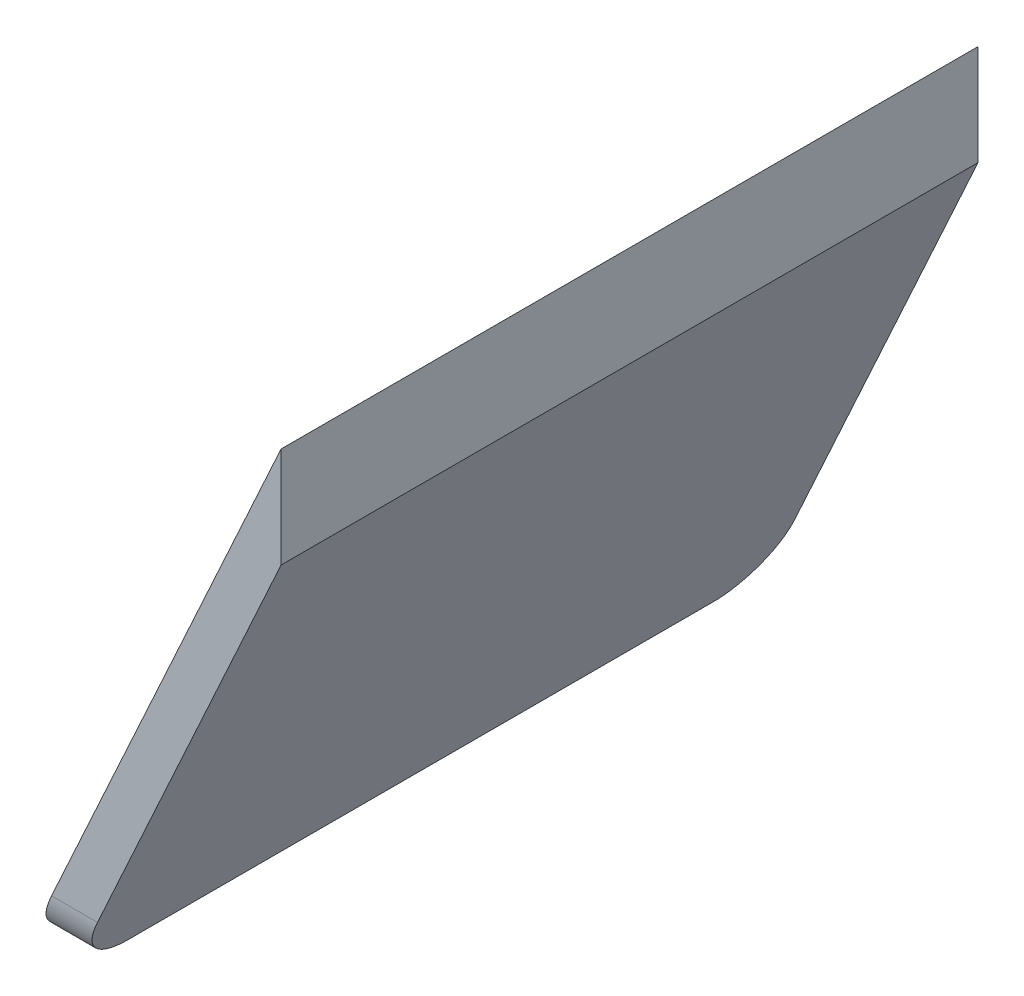
ISO-10303-21;
HEADER;
FILE_DESCRIPTION(('STEP AP214'),'2;1');
FILE_NAME('part.step','',(''),(''),'','','');
FILE_SCHEMA(('AUTOMOTIVE_DESIGN { 1 0 10303 214 1 1 1 1 }'));
ENDSEC;
DATA;
#1=APPLICATION_CONTEXT('core data for automotive mechanical design processes');
#2=APPLICATION_PROTOCOL_DEFINITION('international standard','automotive_design',2000,#1);
#3=PRODUCT_CONTEXT('',#1,'mechanical');
#4=PRODUCT('Part','Part','',(#3));
#5=PRODUCT_RELATED_PRODUCT_CATEGORY('part','',(#4));
#6=PRODUCT_DEFINITION_FORMATION('','',#4);
#7=PRODUCT_DEFINITION_CONTEXT('part definition',#1,'design');
#8=PRODUCT_DEFINITION('design','',#6,#7);
#9=PRODUCT_DEFINITION_SHAPE('','',#8);
#10=(LENGTH_UNIT() NAMED_UNIT(*) SI_UNIT(.MILLI.,.METRE.));
#11=(NAMED_UNIT(*) PLANE_ANGLE_UNIT() SI_UNIT($,.RADIAN.));
#12=(NAMED_UNIT(*) SI_UNIT($,.STERADIAN.) SOLID_ANGLE_UNIT());
#13=UNCERTAINTY_MEASURE_WITH_UNIT(LENGTH_MEASURE(1.E-05),#10,'distance_accuracy_value','');
#14=(GEOMETRIC_REPRESENTATION_CONTEXT(3) GLOBAL_UNCERTAINTY_ASSIGNED_CONTEXT((#13)) GLOBAL_UNIT_ASSIGNED_CONTEXT((#10,
#11,#12)) REPRESENTATION_CONTEXT('',''));
#15=CARTESIAN_POINT('',(0.,0.,0.));
#16=DIRECTION('',(0.,0.,1.));
#17=DIRECTION('',(1.,0.,0.));
#18=AXIS2_PLACEMENT_3D('',#15,#16,#17);
#19=CARTESIAN_POINT('',(-3.29902336935198,0.,50.));
#20=DIRECTION('',(0.,1.,0.));
#21=DIRECTION('',(-1.,0.,0.));
#22=AXIS2_PLACEMENT_3D('',#19,#20,#21);
#23=PLANE('',#22);
#24=DIRECTION('',(0.,0.,-1.));
#25=VECTOR('',#24,1.);
#26=CARTESIAN_POINT('',(-3.29902336935198,0.,50.));
#27=LINE('',#26,#25);
#28=CARTESIAN_POINT('',(-3.29902336935198,0.,46.));
#29=VERTEX_POINT('',#28);
#30=CARTESIAN_POINT('',(-3.29902336935198,0.,4.));
#31=VERTEX_POINT('',#30);
#32=EDGE_CURVE('E346',#29,#31,#27,.T.);
#33=ORIENTED_EDGE('',*,*,#32,.T.);
#34=DIRECTION('',(1.,0.,0.));
#35=VECTOR('',#34,1.);
#36=CARTESIAN_POINT('',(-3.29902336935198,0.,4.));
#37=LINE('',#36,#35);
#38=CARTESIAN_POINT('',(0.,0.,4.));
#39=VERTEX_POINT('',#38);
#40=EDGE_CURVE('E365',#31,#39,#37,.T.);
#41=ORIENTED_EDGE('',*,*,#40,.T.);
#42=DIRECTION('',(0.,0.,-1.));
#43=VECTOR('',#42,1.);
#44=CARTESIAN_POINT('',(0.,0.,50.));
#45=LINE('',#44,#43);
#46=CARTESIAN_POINT('',(0.,0.,46.));
#47=VERTEX_POINT('',#46);
#48=EDGE_CURVE('E360',#47,#39,#45,.T.);
#49=ORIENTED_EDGE('',*,*,#48,.F.);
#50=DIRECTION('',(1.,0.,0.));
#51=VECTOR('',#50,1.);
#52=CARTESIAN_POINT('',(-3.29902336935198,0.,46.));
#53=LINE('',#52,#51);
#54=EDGE_CURVE('E363',#47,#29,#53,.F.);
#55=ORIENTED_EDGE('',*,*,#54,.T.);
#56=EDGE_LOOP('',(#33,#41,#49,#55));
#57=FACE_BOUND('',#56,.T.);
#58=ADVANCED_FACE('F33',(#57),#23,.F.);
#59=CARTESIAN_POINT('',(0.,0.,50.));
#60=DIRECTION('',(-0.909360032993425,0.416010012372535,0.));
#61=DIRECTION('',(-0.416010012372535,-0.909360032993425,0.));
#62=AXIS2_PLACEMENT_3D('',#59,#60,#61);
#63=PLANE('',#62);
#64=ORIENTED_EDGE('',*,*,#48,.T.);
#65=CARTESIAN_POINT('',(1.8299023369352,4.,4.));
#66=DIRECTION('',(-0.909360032993425,0.416010012372535,0.));
#67=DIRECTION('',(0.416010012372535,0.909360032993425,0.));
#68=AXIS2_PLACEMENT_3D('',#65,#66,#67);
#69=ELLIPSE('',#68,4.39869782580264,4.);
#70=CARTESIAN_POINT('',(1.8299023369352,4.,0.));
#71=VERTEX_POINT('',#70);
#72=EDGE_CURVE('E370',#39,#71,#69,.F.);
#73=ORIENTED_EDGE('',*,*,#72,.T.);
#74=DIRECTION('',(0.416010012372534,0.909360032993425,0.));
#75=VECTOR('',#74,1.);
#76=CARTESIAN_POINT('',(0.,0.,0.));
#77=LINE('',#76,#75);
#78=CARTESIAN_POINT('',(15.,32.7886351030573,0.));
#79=VERTEX_POINT('',#78);
#80=EDGE_CURVE('E307',#71,#79,#77,.T.);
#81=ORIENTED_EDGE('',*,*,#80,.T.);
#82=DIRECTION('',(0.,0.,-1.));
#83=VECTOR('',#82,1.);
#84=CARTESIAN_POINT('',(15.,32.7886351030573,50.));
#85=LINE('',#84,#83);
#86=CARTESIAN_POINT('',(15.,32.7886351030573,50.));
#87=VERTEX_POINT('',#86);
#88=EDGE_CURVE('E357',#87,#79,#85,.T.);
#89=ORIENTED_EDGE('',*,*,#88,.F.);
#90=DIRECTION('',(0.416010012372534,0.909360032993425,0.));
#91=VECTOR('',#90,1.);
#92=CARTESIAN_POINT('',(0.,0.,50.));
#93=LINE('',#92,#91);
#94=CARTESIAN_POINT('',(1.8299023369352,4.,50.));
#95=VERTEX_POINT('',#94);
#96=EDGE_CURVE('E339',#95,#87,#93,.T.);
#97=ORIENTED_EDGE('',*,*,#96,.F.);
#98=CARTESIAN_POINT('',(1.8299023369352,4.,46.));
#99=DIRECTION('',(-0.909360032993425,0.416010012372535,0.));
#100=DIRECTION('',(-0.416010012372535,-0.909360032993425,0.));
#101=AXIS2_PLACEMENT_3D('',#98,#99,#100);
#102=ELLIPSE('',#101,4.39869782580264,4.);
#103=EDGE_CURVE('E368',#95,#47,#102,.F.);
#104=ORIENTED_EDGE('',*,*,#103,.T.);
#105=EDGE_LOOP('',(#64,#73,#81,#89,#97,#104));
#106=FACE_BOUND('',#105,.T.);
#107=ADVANCED_FACE('F386',(#106),#63,.F.);
#108=CARTESIAN_POINT('',(15.,32.7886351030573,50.));
#109=DIRECTION('',(-1.,0.,0.));
#110=DIRECTION('',(0.,0.,1.));
#111=AXIS2_PLACEMENT_3D('',#108,#109,#110);
#112=PLANE('',#111);
#113=DIRECTION('',(0.,1.,0.));
#114=VECTOR('',#113,1.);
#115=CARTESIAN_POINT('',(15.,32.7886351030573,0.));
#116=LINE('',#115,#114);
#117=CARTESIAN_POINT('',(15.,40.,0.));
#118=VERTEX_POINT('',#117);
#119=EDGE_CURVE('E348',#79,#118,#116,.T.);
#120=ORIENTED_EDGE('',*,*,#119,.T.);
#121=DIRECTION('',(0.,0.,-1.));
#122=VECTOR('',#121,1.);
#123=CARTESIAN_POINT('',(15.,40.,50.));
#124=LINE('',#123,#122);
#125=CARTESIAN_POINT('',(15.,40.,50.));
#126=VERTEX_POINT('',#125);
#127=EDGE_CURVE('E354',#126,#118,#124,.T.);
#128=ORIENTED_EDGE('',*,*,#127,.F.);
#129=DIRECTION('',(0.,1.,0.));
#130=VECTOR('',#129,1.);
#131=CARTESIAN_POINT('',(15.,32.7886351030573,50.));
#132=LINE('',#131,#130);
#133=EDGE_CURVE('E341',#87,#126,#132,.T.);
#134=ORIENTED_EDGE('',*,*,#133,.F.);
#135=ORIENTED_EDGE('',*,*,#88,.T.);
#136=EDGE_LOOP('',(#120,#128,#134,#135));
#137=FACE_BOUND('',#136,.T.);
#138=ADVANCED_FACE('F393',(#137),#112,.F.);
#139=CARTESIAN_POINT('',(15.,40.,50.));
#140=DIRECTION('',(0.909360032993425,-0.416010012372534,0.));
#141=DIRECTION('',(0.416010012372534,0.909360032993425,0.));
#142=AXIS2_PLACEMENT_3D('',#139,#140,#141);
#143=PLANE('',#142);
#144=DIRECTION('',(0.,0.,-1.));
#145=VECTOR('',#144,1.);
#146=CARTESIAN_POINT('',(10.925539607517,31.0936003299342,24.));
#147=LINE('',#146,#145);
#148=CARTESIAN_POINT('',(10.925539607517,31.0936003299342,24.));
#149=VERTEX_POINT('',#148);
#150=CARTESIAN_POINT('',(10.925539607517,31.0936003299342,13.5));
#151=VERTEX_POINT('',#150);
#152=EDGE_CURVE('E259',#149,#151,#147,.T.);
#153=ORIENTED_EDGE('',*,*,#152,.F.);
#154=DIRECTION('',(0.416010012372534,0.909360032993425,0.));
#155=VECTOR('',#154,1.);
#156=CARTESIAN_POINT('',(8.42947953328174,25.6374401319737,24.));
#157=LINE('',#156,#155);
#158=CARTESIAN_POINT('',(8.42947953328174,25.6374401319737,24.));
#159=VERTEX_POINT('',#158);
#160=EDGE_CURVE('E48',#159,#149,#157,.T.);
#161=ORIENTED_EDGE('',*,*,#160,.F.);
#162=DIRECTION('',(0.,0.,1.));
#163=VECTOR('',#162,1.);
#164=CARTESIAN_POINT('',(8.42947953328174,25.6374401319737,22.));
#165=LINE('',#164,#163);
#166=CARTESIAN_POINT('',(8.42947953328174,25.6374401319737,22.));
#167=VERTEX_POINT('',#166);
#168=EDGE_CURVE('E217',#167,#159,#165,.T.);
#169=ORIENTED_EDGE('',*,*,#168,.F.);
#170=DIRECTION('',(0.416010012372534,0.909360032993425,0.));
#171=VECTOR('',#170,1.);
#172=CARTESIAN_POINT('',(5.10139943430147,18.3625598680263,22.));
#173=LINE('',#172,#171);
#174=CARTESIAN_POINT('',(5.10139943430147,18.3625598680263,22.));
#175=VERTEX_POINT('',#174);
#176=EDGE_CURVE('E220',#175,#167,#173,.T.);
#177=ORIENTED_EDGE('',*,*,#176,.F.);
#178=DIRECTION('',(0.,0.,1.));
#179=VECTOR('',#178,1.);
#180=CARTESIAN_POINT('',(5.10139943430147,18.3625598680263,22.));
#181=LINE('',#180,#179);
#182=CARTESIAN_POINT('',(5.10139943430147,18.3625598680263,28.));
#183=VERTEX_POINT('',#182);
#184=EDGE_CURVE('E300',#175,#183,#181,.T.);
#185=ORIENTED_EDGE('',*,*,#184,.T.);
#186=DIRECTION('',(0.416010012372534,0.909360032993425,0.));
#187=VECTOR('',#186,1.);
#188=CARTESIAN_POINT('',(5.10139943430147,18.3625598680263,28.));
#189=LINE('',#188,#187);
#190=CARTESIAN_POINT('',(8.42947953328174,25.6374401319737,28.));
#191=VERTEX_POINT('',#190);
#192=EDGE_CURVE('E297',#183,#191,#189,.T.);
#193=ORIENTED_EDGE('',*,*,#192,.T.);
#194=DIRECTION('',(0.,0.,-1.));
#195=VECTOR('',#194,1.);
#196=CARTESIAN_POINT('',(8.42947953328174,25.6374401319737,28.));
#197=LINE('',#196,#195);
#198=CARTESIAN_POINT('',(8.42947953328174,25.6374401319737,26.));
#199=VERTEX_POINT('',#198);
#200=EDGE_CURVE('E294',#191,#199,#197,.T.);
#201=ORIENTED_EDGE('',*,*,#200,.T.);
#202=DIRECTION('',(0.416010012372535,0.909360032993425,0.));
#203=VECTOR('',#202,1.);
#204=CARTESIAN_POINT('',(8.42947953328174,25.6374401319737,26.));
#205=LINE('',#204,#203);
#206=CARTESIAN_POINT('',(10.925539607517,31.0936003299342,26.));
#207=VERTEX_POINT('',#206);
#208=EDGE_CURVE('E291',#199,#207,#205,.T.);
#209=ORIENTED_EDGE('',*,*,#208,.T.);
#210=DIRECTION('',(0.,0.,1.));
#211=VECTOR('',#210,1.);
#212=CARTESIAN_POINT('',(10.925539607517,31.0936003299342,26.));
#213=LINE('',#212,#211);
#214=CARTESIAN_POINT('',(10.925539607517,31.0936003299342,36.5));
#215=VERTEX_POINT('',#214);
#216=EDGE_CURVE('E288',#207,#215,#213,.T.);
#217=ORIENTED_EDGE('',*,*,#216,.T.);
#218=DIRECTION('',(-0.416010012372535,-0.909360032993425,0.));
#219=VECTOR('',#218,1.);
#220=CARTESIAN_POINT('',(10.925539607517,31.0936003299342,36.5));
#221=LINE('',#220,#219);
#222=CARTESIAN_POINT('',(8.42947953328175,25.6374401319737,36.5));
#223=VERTEX_POINT('',#222);
#224=EDGE_CURVE('E285',#215,#223,#221,.T.);
#225=ORIENTED_EDGE('',*,*,#224,.T.);
#226=DIRECTION('',(0.,0.,-1.));
#227=VECTOR('',#226,1.);
#228=CARTESIAN_POINT('',(8.42947953328175,25.6374401319737,36.5));
#229=LINE('',#228,#227);
#230=CARTESIAN_POINT('',(8.42947953328174,25.6374401319737,34.5));
#231=VERTEX_POINT('',#230);
#232=EDGE_CURVE('E282',#223,#231,#229,.T.);
#233=ORIENTED_EDGE('',*,*,#232,.T.);
#234=DIRECTION('',(-0.416010012372534,-0.909360032993425,0.));
#235=VECTOR('',#234,1.);
#236=CARTESIAN_POINT('',(8.42947953328174,25.6374401319737,34.5));
#237=LINE('',#236,#235);
#238=CARTESIAN_POINT('',(4.2693794095564,16.5438398020394,34.5));
#239=VERTEX_POINT('',#238);
#240=EDGE_CURVE('E279',#231,#239,#237,.T.);
#241=ORIENTED_EDGE('',*,*,#240,.T.);
#242=DIRECTION('',(0.2763820088115,0.604145922398015,0.747409318683659));
#243=VECTOR('',#242,1.);
#244=CARTESIAN_POINT('',(2.60533936006626,12.9063996700657,30.));
#245=LINE('',#244,#243);
#246=CARTESIAN_POINT('',(2.60533936006626,12.9063996700657,30.));
#247=VERTEX_POINT('',#246);
#248=EDGE_CURVE('E276',#247,#239,#245,.T.);
#249=ORIENTED_EDGE('',*,*,#248,.F.);
#250=DIRECTION('',(0.,0.,1.));
#251=VECTOR('',#250,1.);
#252=CARTESIAN_POINT('',(2.60533936006626,12.9063996700657,20.));
#253=LINE('',#252,#251);
#254=CARTESIAN_POINT('',(2.60533936006626,12.9063996700657,20.));
#255=VERTEX_POINT('',#254);
#256=EDGE_CURVE('E273',#255,#247,#253,.T.);
#257=ORIENTED_EDGE('',*,*,#256,.F.);
#258=DIRECTION('',(-0.276382008811499,-0.604145922398015,0.74740931868366));
#259=VECTOR('',#258,1.);
#260=CARTESIAN_POINT('',(4.2693794095564,16.5438398020394,15.5));
#261=LINE('',#260,#259);
#262=CARTESIAN_POINT('',(4.2693794095564,16.5438398020394,15.5));
#263=VERTEX_POINT('',#262);
#264=EDGE_CURVE('E270',#263,#255,#261,.T.);
#265=ORIENTED_EDGE('',*,*,#264,.F.);
#266=DIRECTION('',(-0.416010012372534,-0.909360032993426,0.));
#267=VECTOR('',#266,1.);
#268=CARTESIAN_POINT('',(8.42947953328175,25.6374401319737,15.5));
#269=LINE('',#268,#267);
#270=CARTESIAN_POINT('',(8.42947953328175,25.6374401319737,15.5));
#271=VERTEX_POINT('',#270);
#272=EDGE_CURVE('E267',#271,#263,#269,.T.);
#273=ORIENTED_EDGE('',*,*,#272,.F.);
#274=DIRECTION('',(0.,0.,1.));
#275=VECTOR('',#274,1.);
#276=CARTESIAN_POINT('',(8.42947953328175,25.6374401319737,13.5));
#277=LINE('',#276,#275);
#278=CARTESIAN_POINT('',(8.42947953328175,25.6374401319737,13.5));
#279=VERTEX_POINT('',#278);
#280=EDGE_CURVE('E264',#279,#271,#277,.T.);
#281=ORIENTED_EDGE('',*,*,#280,.F.);
#282=DIRECTION('',(-0.416010012372535,-0.909360032993425,0.));
#283=VECTOR('',#282,1.);
#284=CARTESIAN_POINT('',(10.925539607517,31.0936003299342,13.5));
#285=LINE('',#284,#283);
#286=EDGE_CURVE('E261',#151,#279,#285,.T.);
#287=ORIENTED_EDGE('',*,*,#286,.F.);
#288=EDGE_LOOP('',(#153,#161,#169,#177,#185,#193,#201,#209,#217,#225,#233,#241,#249,#257,#265,
#273,#281,#287));
#289=FACE_BOUND('',#288,.T.);
#290=DIRECTION('',(-0.416010012372534,-0.909360032993425,0.));
#291=VECTOR('',#290,1.);
#292=CARTESIAN_POINT('',(15.,40.,0.));
#293=LINE('',#292,#291);
#294=CARTESIAN_POINT('',(-1.46912103241678,3.99999999999999,0.));
#295=VERTEX_POINT('',#294);
#296=EDGE_CURVE('E342',#118,#295,#293,.T.);
#297=ORIENTED_EDGE('',*,*,#296,.T.);
#298=CARTESIAN_POINT('',(-1.46912103241678,4.,4.));
#299=DIRECTION('',(0.909360032993425,-0.416010012372534,0.));
#300=DIRECTION('',(0.416010012372534,0.909360032993425,0.));
#301=AXIS2_PLACEMENT_3D('',#298,#299,#300);
#302=ELLIPSE('',#301,4.39869782580264,4.);
#303=EDGE_CURVE('E41',#295,#31,#302,.F.);
#304=ORIENTED_EDGE('',*,*,#303,.T.);
#305=ORIENTED_EDGE('',*,*,#32,.F.);
#306=CARTESIAN_POINT('',(-1.46912103241678,4.,46.));
#307=DIRECTION('',(0.909360032993425,-0.416010012372534,0.));
#308=DIRECTION('',(-0.416010012372534,-0.909360032993425,0.));
#309=AXIS2_PLACEMENT_3D('',#306,#307,#308);
#310=ELLIPSE('',#309,4.39869782580264,4.);
#311=CARTESIAN_POINT('',(-1.46912103241678,3.99999999999999,50.));
#312=VERTEX_POINT('',#311);
#313=EDGE_CURVE('E56',#29,#312,#310,.F.);
#314=ORIENTED_EDGE('',*,*,#313,.T.);
#315=DIRECTION('',(-0.416010012372534,-0.909360032993425,0.));
#316=VECTOR('',#315,1.);
#317=CARTESIAN_POINT('',(15.,40.,50.));
#318=LINE('',#317,#316);
#319=EDGE_CURVE('E344',#126,#312,#318,.T.);
#320=ORIENTED_EDGE('',*,*,#319,.F.);
#321=ORIENTED_EDGE('',*,*,#127,.T.);
#322=EDGE_LOOP('',(#297,#304,#305,#314,#320,#321));
#323=FACE_BOUND('',#322,.T.);
#324=ADVANCED_FACE('F375',(#289,#323),#143,.F.);
#325=CARTESIAN_POINT('',(0.,0.,50.));
#326=DIRECTION('',(0.,0.,1.));
#327=DIRECTION('',(1.,0.,0.));
#328=AXIS2_PLACEMENT_3D('',#325,#326,#327);
#329=PLANE('',#328);
#330=ORIENTED_EDGE('',*,*,#319,.T.);
#331=DIRECTION('',(1.,0.,0.));
#332=VECTOR('',#331,1.);
#333=CARTESIAN_POINT('',(0.,4.,50.));
#334=LINE('',#333,#332);
#335=EDGE_CURVE('E11',#312,#95,#334,.T.);
#336=ORIENTED_EDGE('',*,*,#335,.T.);
#337=ORIENTED_EDGE('',*,*,#96,.T.);
#338=ORIENTED_EDGE('',*,*,#133,.T.);
#339=EDGE_LOOP('',(#330,#336,#337,#338));
#340=FACE_BOUND('',#339,.T.);
#341=ADVANCED_FACE('F397',(#340),#329,.T.);
#342=CARTESIAN_POINT('',(0.,0.,0.));
#343=DIRECTION('',(0.,0.,1.));
#344=DIRECTION('',(1.,0.,0.));
#345=AXIS2_PLACEMENT_3D('',#342,#343,#344);
#346=PLANE('',#345);
#347=ORIENTED_EDGE('',*,*,#80,.F.);
#348=DIRECTION('',(1.,0.,0.));
#349=VECTOR('',#348,1.);
#350=CARTESIAN_POINT('',(0.,4.,0.));
#351=LINE('',#350,#349);
#352=EDGE_CURVE('E372',#71,#295,#351,.F.);
#353=ORIENTED_EDGE('',*,*,#352,.T.);
#354=ORIENTED_EDGE('',*,*,#296,.F.);
#355=ORIENTED_EDGE('',*,*,#119,.F.);
#356=EDGE_LOOP('',(#347,#353,#354,#355));
#357=FACE_BOUND('',#356,.T.);
#358=ADVANCED_FACE('F390',(#357),#346,.F.);
#359=CARTESIAN_POINT('',(-3.29902336935198,4.,4.));
#360=DIRECTION('',(1.,0.,0.));
#361=DIRECTION('',(0.,1.,0.));
#362=AXIS2_PLACEMENT_3D('',#359,#360,#361);
#363=CYLINDRICAL_SURFACE('',#362,4.);
#364=ORIENTED_EDGE('',*,*,#303,.F.);
#365=ORIENTED_EDGE('',*,*,#352,.F.);
#366=ORIENTED_EDGE('',*,*,#72,.F.);
#367=ORIENTED_EDGE('',*,*,#40,.F.);
#368=EDGE_LOOP('',(#364,#365,#366,#367));
#369=FACE_BOUND('',#368,.T.);
#370=ADVANCED_FACE('F383',(#369),#363,.T.);
#371=CARTESIAN_POINT('',(0.,4.,46.));
#372=DIRECTION('',(-1.,0.,0.));
#373=DIRECTION('',(0.,-1.,0.));
#374=AXIS2_PLACEMENT_3D('',#371,#372,#373);
#375=CYLINDRICAL_SURFACE('',#374,4.);
#376=ORIENTED_EDGE('',*,*,#313,.F.);
#377=ORIENTED_EDGE('',*,*,#54,.F.);
#378=ORIENTED_EDGE('',*,*,#103,.F.);
#379=ORIENTED_EDGE('',*,*,#335,.F.);
#380=EDGE_LOOP('',(#376,#377,#378,#379));
#381=FACE_BOUND('',#380,.T.);
#382=ADVANCED_FACE('F35',(#381),#375,.T.);
#383=CARTESIAN_POINT('',(9.79351958277188,25.0134251134149,24.));
#384=DIRECTION('',(0.,0.,1.));
#385=DIRECTION('',(1.,0.,0.));
#386=AXIS2_PLACEMENT_3D('',#383,#384,#385);
#387=PLANE('',#386);
#388=ORIENTED_EDGE('',*,*,#160,.T.);
#389=DIRECTION('',(-0.909360032993425,0.416010012372534,0.));
#390=VECTOR('',#389,1.);
#391=CARTESIAN_POINT('',(12.2895796570071,30.4695853113754,24.));
#392=LINE('',#391,#390);
#393=CARTESIAN_POINT('',(12.2895796570071,30.4695853113754,24.));
#394=VERTEX_POINT('',#393);
#395=EDGE_CURVE('E194',#394,#149,#392,.T.);
#396=ORIENTED_EDGE('',*,*,#395,.F.);
#397=DIRECTION('',(0.416010012372534,0.909360032993425,0.));
#398=VECTOR('',#397,1.);
#399=CARTESIAN_POINT('',(9.79351958277188,25.0134251134149,24.));
#400=LINE('',#399,#398);
#401=CARTESIAN_POINT('',(9.79351958277188,25.0134251134149,24.));
#402=VERTEX_POINT('',#401);
#403=EDGE_CURVE('E198',#402,#394,#400,.T.);
#404=ORIENTED_EDGE('',*,*,#403,.F.);
#405=DIRECTION('',(-0.909360032993425,0.416010012372534,0.));
#406=VECTOR('',#405,1.);
#407=CARTESIAN_POINT('',(9.79351958277188,25.0134251134149,24.));
#408=LINE('',#407,#406);
#409=EDGE_CURVE('E305',#402,#159,#408,.T.);
#410=ORIENTED_EDGE('',*,*,#409,.T.);
#411=EDGE_LOOP('',(#388,#396,#404,#410));
#412=FACE_BOUND('',#411,.T.);
#413=ADVANCED_FACE('F196',(#412),#387,.F.);
#414=CARTESIAN_POINT('',(9.79351958277188,25.0134251134149,22.));
#415=DIRECTION('',(-0.416010012372534,-0.909360032993425,0.));
#416=DIRECTION('',(0.909360032993425,-0.416010012372534,0.));
#417=AXIS2_PLACEMENT_3D('',#414,#415,#416);
#418=PLANE('',#417);
#419=ORIENTED_EDGE('',*,*,#168,.T.);
#420=ORIENTED_EDGE('',*,*,#409,.F.);
#421=DIRECTION('',(0.,0.,1.));
#422=VECTOR('',#421,1.);
#423=CARTESIAN_POINT('',(9.79351958277188,25.0134251134149,22.));
#424=LINE('',#423,#422);
#425=CARTESIAN_POINT('',(9.79351958277188,25.0134251134149,22.));
#426=VERTEX_POINT('',#425);
#427=EDGE_CURVE('E204',#426,#402,#424,.T.);
#428=ORIENTED_EDGE('',*,*,#427,.F.);
#429=DIRECTION('',(-0.909360032993425,0.416010012372534,0.));
#430=VECTOR('',#429,1.);
#431=CARTESIAN_POINT('',(9.79351958277188,25.0134251134149,22.));
#432=LINE('',#431,#430);
#433=EDGE_CURVE('E308',#426,#167,#432,.T.);
#434=ORIENTED_EDGE('',*,*,#433,.T.);
#435=EDGE_LOOP('',(#419,#420,#428,#434));
#436=FACE_BOUND('',#435,.T.);
#437=ADVANCED_FACE('F405',(#436),#418,.F.);
#438=CARTESIAN_POINT('',(6.46543948379161,17.7385448494675,22.));
#439=DIRECTION('',(0.,0.,1.));
#440=DIRECTION('',(1.,0.,0.));
#441=AXIS2_PLACEMENT_3D('',#438,#439,#440);
#442=PLANE('',#441);
#443=ORIENTED_EDGE('',*,*,#176,.T.);
#444=ORIENTED_EDGE('',*,*,#433,.F.);
#445=DIRECTION('',(0.416010012372534,0.909360032993425,0.));
#446=VECTOR('',#445,1.);
#447=CARTESIAN_POINT('',(6.46543948379161,17.7385448494675,22.));
#448=LINE('',#447,#446);
#449=CARTESIAN_POINT('',(6.46543948379161,17.7385448494675,22.));
#450=VERTEX_POINT('',#449);
#451=EDGE_CURVE('E255',#450,#426,#448,.T.);
#452=ORIENTED_EDGE('',*,*,#451,.F.);
#453=DIRECTION('',(-0.909360032993425,0.416010012372534,0.));
#454=VECTOR('',#453,1.);
#455=CARTESIAN_POINT('',(6.46543948379161,17.7385448494675,22.));
#456=LINE('',#455,#454);
#457=EDGE_CURVE('E310',#450,#175,#456,.T.);
#458=ORIENTED_EDGE('',*,*,#457,.T.);
#459=EDGE_LOOP('',(#443,#444,#452,#458));
#460=FACE_BOUND('',#459,.T.);
#461=ADVANCED_FACE('F480',(#460),#442,.F.);
#462=CARTESIAN_POINT('',(6.46543948379161,17.7385448494675,22.));
#463=DIRECTION('',(-0.416010012372534,-0.909360032993425,0.));
#464=DIRECTION('',(0.909360032993425,-0.416010012372534,0.));
#465=AXIS2_PLACEMENT_3D('',#462,#463,#464);
#466=PLANE('',#465);
#467=ORIENTED_EDGE('',*,*,#184,.F.);
#468=ORIENTED_EDGE('',*,*,#457,.F.);
#469=DIRECTION('',(0.,0.,1.));
#470=VECTOR('',#469,1.);
#471=CARTESIAN_POINT('',(6.46543948379161,17.7385448494675,22.));
#472=LINE('',#471,#470);
#473=CARTESIAN_POINT('',(6.46543948379161,17.7385448494675,28.));
#474=VERTEX_POINT('',#473);
#475=EDGE_CURVE('E253',#450,#474,#472,.T.);
#476=ORIENTED_EDGE('',*,*,#475,.T.);
#477=DIRECTION('',(-0.909360032993425,0.416010012372534,0.));
#478=VECTOR('',#477,1.);
#479=CARTESIAN_POINT('',(6.46543948379161,17.7385448494675,28.));
#480=LINE('',#479,#478);
#481=EDGE_CURVE('E312',#474,#183,#480,.T.);
#482=ORIENTED_EDGE('',*,*,#481,.T.);
#483=EDGE_LOOP('',(#467,#468,#476,#482));
#484=FACE_BOUND('',#483,.T.);
#485=ADVANCED_FACE('F476',(#484),#466,.T.);
#486=CARTESIAN_POINT('',(6.46543948379161,17.7385448494675,28.));
#487=DIRECTION('',(0.,0.,1.));
#488=DIRECTION('',(0.,-1.,0.));
#489=AXIS2_PLACEMENT_3D('',#486,#487,#488);
#490=PLANE('',#489);
#491=ORIENTED_EDGE('',*,*,#192,.F.);
#492=ORIENTED_EDGE('',*,*,#481,.F.);
#493=DIRECTION('',(0.416010012372534,0.909360032993425,0.));
#494=VECTOR('',#493,1.);
#495=CARTESIAN_POINT('',(6.46543948379161,17.7385448494675,28.));
#496=LINE('',#495,#494);
#497=CARTESIAN_POINT('',(9.79351958277188,25.0134251134149,28.));
#498=VERTEX_POINT('',#497);
#499=EDGE_CURVE('E251',#474,#498,#496,.T.);
#500=ORIENTED_EDGE('',*,*,#499,.T.);
#501=DIRECTION('',(-0.909360032993425,0.416010012372534,0.));
#502=VECTOR('',#501,1.);
#503=CARTESIAN_POINT('',(9.79351958277188,25.0134251134149,28.));
#504=LINE('',#503,#502);
#505=EDGE_CURVE('E314',#498,#191,#504,.T.);
#506=ORIENTED_EDGE('',*,*,#505,.T.);
#507=EDGE_LOOP('',(#491,#492,#500,#506));
#508=FACE_BOUND('',#507,.T.);
#509=ADVANCED_FACE('F472',(#508),#490,.T.);
#510=CARTESIAN_POINT('',(9.79351958277188,25.0134251134149,28.));
#511=DIRECTION('',(0.416010012372534,0.909360032993425,0.));
#512=DIRECTION('',(-0.909360032993425,0.416010012372534,0.));
#513=AXIS2_PLACEMENT_3D('',#510,#511,#512);
#514=PLANE('',#513);
#515=ORIENTED_EDGE('',*,*,#200,.F.);
#516=ORIENTED_EDGE('',*,*,#505,.F.);
#517=DIRECTION('',(0.,0.,-1.));
#518=VECTOR('',#517,1.);
#519=CARTESIAN_POINT('',(9.79351958277188,25.0134251134149,28.));
#520=LINE('',#519,#518);
#521=CARTESIAN_POINT('',(9.79351958277188,25.0134251134149,26.));
#522=VERTEX_POINT('',#521);
#523=EDGE_CURVE('E249',#498,#522,#520,.T.);
#524=ORIENTED_EDGE('',*,*,#523,.T.);
#525=DIRECTION('',(-0.909360032993425,0.416010012372534,0.));
#526=VECTOR('',#525,1.);
#527=CARTESIAN_POINT('',(9.79351958277188,25.0134251134149,26.));
#528=LINE('',#527,#526);
#529=EDGE_CURVE('E316',#522,#199,#528,.T.);
#530=ORIENTED_EDGE('',*,*,#529,.T.);
#531=EDGE_LOOP('',(#515,#516,#524,#530));
#532=FACE_BOUND('',#531,.T.);
#533=ADVANCED_FACE('F468',(#532),#514,.T.);
#534=CARTESIAN_POINT('',(9.79351958277188,25.0134251134149,26.));
#535=DIRECTION('',(0.,0.,1.));
#536=DIRECTION('',(0.,-1.,0.));
#537=AXIS2_PLACEMENT_3D('',#534,#535,#536);
#538=PLANE('',#537);
#539=ORIENTED_EDGE('',*,*,#208,.F.);
#540=ORIENTED_EDGE('',*,*,#529,.F.);
#541=DIRECTION('',(0.416010012372535,0.909360032993425,0.));
#542=VECTOR('',#541,1.);
#543=CARTESIAN_POINT('',(9.79351958277188,25.0134251134149,26.));
#544=LINE('',#543,#542);
#545=CARTESIAN_POINT('',(12.2895796570071,30.4695853113754,26.));
#546=VERTEX_POINT('',#545);
#547=EDGE_CURVE('E247',#522,#546,#544,.T.);
#548=ORIENTED_EDGE('',*,*,#547,.T.);
#549=DIRECTION('',(-0.909360032993425,0.416010012372534,0.));
#550=VECTOR('',#549,1.);
#551=CARTESIAN_POINT('',(12.2895796570071,30.4695853113754,26.));
#552=LINE('',#551,#550);
#553=EDGE_CURVE('E318',#546,#207,#552,.T.);
#554=ORIENTED_EDGE('',*,*,#553,.T.);
#555=EDGE_LOOP('',(#539,#540,#548,#554));
#556=FACE_BOUND('',#555,.T.);
#557=ADVANCED_FACE('F464',(#556),#538,.T.);
#558=CARTESIAN_POINT('',(12.2895796570071,30.4695853113754,26.));
#559=DIRECTION('',(-0.416010012372534,-0.909360032993425,0.));
#560=DIRECTION('',(0.909360032993425,-0.416010012372534,0.));
#561=AXIS2_PLACEMENT_3D('',#558,#559,#560);
#562=PLANE('',#561);
#563=ORIENTED_EDGE('',*,*,#216,.F.);
#564=ORIENTED_EDGE('',*,*,#553,.F.);
#565=DIRECTION('',(0.,0.,1.));
#566=VECTOR('',#565,1.);
#567=CARTESIAN_POINT('',(12.2895796570071,30.4695853113754,26.));
#568=LINE('',#567,#566);
#569=CARTESIAN_POINT('',(12.2895796570071,30.4695853113754,36.5));
#570=VERTEX_POINT('',#569);
#571=EDGE_CURVE('E245',#546,#570,#568,.T.);
#572=ORIENTED_EDGE('',*,*,#571,.T.);
#573=DIRECTION('',(-0.909360032993425,0.416010012372534,0.));
#574=VECTOR('',#573,1.);
#575=CARTESIAN_POINT('',(12.2895796570071,30.4695853113754,36.5));
#576=LINE('',#575,#574);
#577=EDGE_CURVE('E320',#570,#215,#576,.T.);
#578=ORIENTED_EDGE('',*,*,#577,.T.);
#579=EDGE_LOOP('',(#563,#564,#572,#578));
#580=FACE_BOUND('',#579,.T.);
#581=ADVANCED_FACE('F460',(#580),#562,.T.);
#582=CARTESIAN_POINT('',(12.2895796570071,30.4695853113754,36.5));
#583=DIRECTION('',(0.,0.,-1.));
#584=DIRECTION('',(-1.,0.,0.));
#585=AXIS2_PLACEMENT_3D('',#582,#583,#584);
#586=PLANE('',#585);
#587=ORIENTED_EDGE('',*,*,#224,.F.);
#588=ORIENTED_EDGE('',*,*,#577,.F.);
#589=DIRECTION('',(-0.416010012372535,-0.909360032993425,0.));
#590=VECTOR('',#589,1.);
#591=CARTESIAN_POINT('',(12.2895796570071,30.4695853113754,36.5));
#592=LINE('',#591,#590);
#593=CARTESIAN_POINT('',(9.79351958277189,25.0134251134149,36.5));
#594=VERTEX_POINT('',#593);
#595=EDGE_CURVE('E243',#570,#594,#592,.T.);
#596=ORIENTED_EDGE('',*,*,#595,.T.);
#597=DIRECTION('',(-0.909360032993425,0.416010012372534,0.));
#598=VECTOR('',#597,1.);
#599=CARTESIAN_POINT('',(9.79351958277189,25.0134251134149,36.5));
#600=LINE('',#599,#598);
#601=EDGE_CURVE('E322',#594,#223,#600,.T.);
#602=ORIENTED_EDGE('',*,*,#601,.T.);
#603=EDGE_LOOP('',(#587,#588,#596,#602));
#604=FACE_BOUND('',#603,.T.);
#605=ADVANCED_FACE('F456',(#604),#586,.T.);
#606=CARTESIAN_POINT('',(9.79351958277189,25.0134251134149,36.5));
#607=DIRECTION('',(0.416010012372534,0.909360032993425,0.));
#608=DIRECTION('',(-0.909360032993425,0.416010012372534,0.));
#609=AXIS2_PLACEMENT_3D('',#606,#607,#608);
#610=PLANE('',#609);
#611=ORIENTED_EDGE('',*,*,#232,.F.);
#612=ORIENTED_EDGE('',*,*,#601,.F.);
#613=DIRECTION('',(0.,0.,-1.));
#614=VECTOR('',#613,1.);
#615=CARTESIAN_POINT('',(9.79351958277189,25.0134251134149,36.5));
#616=LINE('',#615,#614);
#617=CARTESIAN_POINT('',(9.79351958277188,25.0134251134149,34.5));
#618=VERTEX_POINT('',#617);
#619=EDGE_CURVE('E241',#594,#618,#616,.T.);
#620=ORIENTED_EDGE('',*,*,#619,.T.);
#621=DIRECTION('',(-0.909360032993425,0.416010012372534,0.));
#622=VECTOR('',#621,1.);
#623=CARTESIAN_POINT('',(9.79351958277188,25.0134251134149,34.5));
#624=LINE('',#623,#622);
#625=EDGE_CURVE('E324',#618,#231,#624,.T.);
#626=ORIENTED_EDGE('',*,*,#625,.T.);
#627=EDGE_LOOP('',(#611,#612,#620,#626));
#628=FACE_BOUND('',#627,.T.);
#629=ADVANCED_FACE('F452',(#628),#610,.T.);
#630=CARTESIAN_POINT('',(9.79351958277188,25.0134251134149,34.5));
#631=DIRECTION('',(0.,0.,-1.));
#632=DIRECTION('',(0.,1.,0.));
#633=AXIS2_PLACEMENT_3D('',#630,#631,#632);
#634=PLANE('',#633);
#635=ORIENTED_EDGE('',*,*,#240,.F.);
#636=ORIENTED_EDGE('',*,*,#625,.F.);
#637=DIRECTION('',(-0.416010012372534,-0.909360032993425,0.));
#638=VECTOR('',#637,1.);
#639=CARTESIAN_POINT('',(9.79351958277188,25.0134251134149,34.5));
#640=LINE('',#639,#638);
#641=CARTESIAN_POINT('',(5.63341945904654,15.9198247834806,34.5));
#642=VERTEX_POINT('',#641);
#643=EDGE_CURVE('E239',#618,#642,#640,.T.);
#644=ORIENTED_EDGE('',*,*,#643,.T.);
#645=DIRECTION('',(-0.909360032993425,0.416010012372534,0.));
#646=VECTOR('',#645,1.);
#647=CARTESIAN_POINT('',(5.63341945904654,15.9198247834806,34.5));
#648=LINE('',#647,#646);
#649=EDGE_CURVE('E326',#642,#239,#648,.T.);
#650=ORIENTED_EDGE('',*,*,#649,.T.);
#651=EDGE_LOOP('',(#635,#636,#644,#650));
#652=FACE_BOUND('',#651,.T.);
#653=ADVANCED_FACE('F448',(#652),#634,.T.);
#654=CARTESIAN_POINT('',(3.9693794095564,12.2823846515069,30.));
#655=DIRECTION('',(-0.310929759912937,-0.679664162697766,0.66436383882992));
#656=DIRECTION('',(0.,-0.699011833040673,-0.715110101501243));
#657=AXIS2_PLACEMENT_3D('',#654,#655,#656);
#658=PLANE('',#657);
#659=ORIENTED_EDGE('',*,*,#248,.T.);
#660=ORIENTED_EDGE('',*,*,#649,.F.);
#661=DIRECTION('',(0.2763820088115,0.604145922398015,0.747409318683659));
#662=VECTOR('',#661,1.);
#663=CARTESIAN_POINT('',(3.9693794095564,12.2823846515069,30.));
#664=LINE('',#663,#662);
#665=CARTESIAN_POINT('',(3.9693794095564,12.2823846515069,30.));
#666=VERTEX_POINT('',#665);
#667=EDGE_CURVE('E236',#666,#642,#664,.T.);
#668=ORIENTED_EDGE('',*,*,#667,.F.);
#669=DIRECTION('',(-0.909360032993425,0.416010012372534,0.));
#670=VECTOR('',#669,1.);
#671=CARTESIAN_POINT('',(3.9693794095564,12.2823846515069,30.));
#672=LINE('',#671,#670);
#673=EDGE_CURVE('E328',#666,#247,#672,.T.);
#674=ORIENTED_EDGE('',*,*,#673,.T.);
#675=EDGE_LOOP('',(#659,#660,#668,#674));
#676=FACE_BOUND('',#675,.T.);
#677=ADVANCED_FACE('F444',(#676),#658,.F.);
#678=CARTESIAN_POINT('',(3.9693794095564,12.2823846515069,20.));
#679=DIRECTION('',(-0.416010012372534,-0.909360032993425,0.));
#680=DIRECTION('',(0.909360032993425,-0.416010012372534,0.));
#681=AXIS2_PLACEMENT_3D('',#678,#679,#680);
#682=PLANE('',#681);
#683=ORIENTED_EDGE('',*,*,#256,.T.);
#684=ORIENTED_EDGE('',*,*,#673,.F.);
#685=DIRECTION('',(0.,0.,1.));
#686=VECTOR('',#685,1.);
#687=CARTESIAN_POINT('',(3.9693794095564,12.2823846515069,20.));
#688=LINE('',#687,#686);
#689=CARTESIAN_POINT('',(3.9693794095564,12.2823846515069,20.));
#690=VERTEX_POINT('',#689);
#691=EDGE_CURVE('E233',#690,#666,#688,.T.);
#692=ORIENTED_EDGE('',*,*,#691,.F.);
#693=DIRECTION('',(-0.909360032993425,0.416010012372534,0.));
#694=VECTOR('',#693,1.);
#695=CARTESIAN_POINT('',(3.9693794095564,12.2823846515069,20.));
#696=LINE('',#695,#694);
#697=EDGE_CURVE('E330',#690,#255,#696,.T.);
#698=ORIENTED_EDGE('',*,*,#697,.T.);
#699=EDGE_LOOP('',(#683,#684,#692,#698));
#700=FACE_BOUND('',#699,.T.);
#701=ADVANCED_FACE('F440',(#700),#682,.F.);
#702=CARTESIAN_POINT('',(5.63341945904654,15.9198247834806,15.5));
#703=DIRECTION('',(-0.310929759912937,-0.679664162697766,-0.66436383882992));
#704=DIRECTION('',(0.,0.699011833040673,-0.715110101501243));
#705=AXIS2_PLACEMENT_3D('',#702,#703,#704);
#706=PLANE('',#705);
#707=ORIENTED_EDGE('',*,*,#264,.T.);
#708=ORIENTED_EDGE('',*,*,#697,.F.);
#709=DIRECTION('',(-0.276382008811499,-0.604145922398015,0.74740931868366));
#710=VECTOR('',#709,1.);
#711=CARTESIAN_POINT('',(5.63341945904654,15.9198247834806,15.5));
#712=LINE('',#711,#710);
#713=CARTESIAN_POINT('',(5.63341945904654,15.9198247834806,15.5));
#714=VERTEX_POINT('',#713);
#715=EDGE_CURVE('E230',#714,#690,#712,.T.);
#716=ORIENTED_EDGE('',*,*,#715,.F.);
#717=DIRECTION('',(-0.909360032993425,0.416010012372534,0.));
#718=VECTOR('',#717,1.);
#719=CARTESIAN_POINT('',(5.63341945904654,15.9198247834806,15.5));
#720=LINE('',#719,#718);
#721=EDGE_CURVE('E332',#714,#263,#720,.T.);
#722=ORIENTED_EDGE('',*,*,#721,.T.);
#723=EDGE_LOOP('',(#707,#708,#716,#722));
#724=FACE_BOUND('',#723,.T.);
#725=ADVANCED_FACE('F436',(#724),#706,.F.);
#726=CARTESIAN_POINT('',(9.79351958277189,25.0134251134149,15.5));
#727=DIRECTION('',(0.,0.,-1.));
#728=DIRECTION('',(0.,1.,0.));
#729=AXIS2_PLACEMENT_3D('',#726,#727,#728);
#730=PLANE('',#729);
#731=ORIENTED_EDGE('',*,*,#272,.T.);
#732=ORIENTED_EDGE('',*,*,#721,.F.);
#733=DIRECTION('',(-0.416010012372534,-0.909360032993426,0.));
#734=VECTOR('',#733,1.);
#735=CARTESIAN_POINT('',(9.79351958277189,25.0134251134149,15.5));
#736=LINE('',#735,#734);
#737=CARTESIAN_POINT('',(9.79351958277189,25.0134251134149,15.5));
#738=VERTEX_POINT('',#737);
#739=EDGE_CURVE('E227',#738,#714,#736,.T.);
#740=ORIENTED_EDGE('',*,*,#739,.F.);
#741=DIRECTION('',(-0.909360032993425,0.416010012372534,0.));
#742=VECTOR('',#741,1.);
#743=CARTESIAN_POINT('',(9.79351958277189,25.0134251134149,15.5));
#744=LINE('',#743,#742);
#745=EDGE_CURVE('E334',#738,#271,#744,.T.);
#746=ORIENTED_EDGE('',*,*,#745,.T.);
#747=EDGE_LOOP('',(#731,#732,#740,#746));
#748=FACE_BOUND('',#747,.T.);
#749=ADVANCED_FACE('F432',(#748),#730,.F.);
#750=CARTESIAN_POINT('',(9.79351958277189,25.0134251134149,13.5));
#751=DIRECTION('',(-0.416010012372534,-0.909360032993425,0.));
#752=DIRECTION('',(0.909360032993425,-0.416010012372534,0.));
#753=AXIS2_PLACEMENT_3D('',#750,#751,#752);
#754=PLANE('',#753);
#755=ORIENTED_EDGE('',*,*,#280,.T.);
#756=ORIENTED_EDGE('',*,*,#745,.F.);
#757=DIRECTION('',(0.,0.,1.));
#758=VECTOR('',#757,1.);
#759=CARTESIAN_POINT('',(9.79351958277189,25.0134251134149,13.5));
#760=LINE('',#759,#758);
#761=CARTESIAN_POINT('',(9.79351958277189,25.0134251134149,13.5));
#762=VERTEX_POINT('',#761);
#763=EDGE_CURVE('E224',#762,#738,#760,.T.);
#764=ORIENTED_EDGE('',*,*,#763,.F.);
#765=DIRECTION('',(-0.909360032993425,0.416010012372534,0.));
#766=VECTOR('',#765,1.);
#767=CARTESIAN_POINT('',(9.79351958277189,25.0134251134149,13.5));
#768=LINE('',#767,#766);
#769=EDGE_CURVE('E336',#762,#279,#768,.T.);
#770=ORIENTED_EDGE('',*,*,#769,.T.);
#771=EDGE_LOOP('',(#755,#756,#764,#770));
#772=FACE_BOUND('',#771,.T.);
#773=ADVANCED_FACE('F428',(#772),#754,.F.);
#774=CARTESIAN_POINT('',(12.2895796570071,30.4695853113754,13.5));
#775=DIRECTION('',(0.,0.,-1.));
#776=DIRECTION('',(-1.,0.,0.));
#777=AXIS2_PLACEMENT_3D('',#774,#775,#776);
#778=PLANE('',#777);
#779=ORIENTED_EDGE('',*,*,#286,.T.);
#780=ORIENTED_EDGE('',*,*,#769,.F.);
#781=DIRECTION('',(-0.416010012372535,-0.909360032993425,0.));
#782=VECTOR('',#781,1.);
#783=CARTESIAN_POINT('',(12.2895796570071,30.4695853113754,13.5));
#784=LINE('',#783,#782);
#785=CARTESIAN_POINT('',(12.2895796570071,30.4695853113754,13.5));
#786=VERTEX_POINT('',#785);
#787=EDGE_CURVE('E212',#786,#762,#784,.T.);
#788=ORIENTED_EDGE('',*,*,#787,.F.);
#789=DIRECTION('',(-0.909360032993425,0.416010012372534,0.));
#790=VECTOR('',#789,1.);
#791=CARTESIAN_POINT('',(12.2895796570071,30.4695853113754,13.5));
#792=LINE('',#791,#790);
#793=EDGE_CURVE('E203',#786,#151,#792,.T.);
#794=ORIENTED_EDGE('',*,*,#793,.T.);
#795=EDGE_LOOP('',(#779,#780,#788,#794));
#796=FACE_BOUND('',#795,.T.);
#797=ADVANCED_FACE('F425',(#796),#778,.F.);
#798=CARTESIAN_POINT('',(12.2895796570071,30.4695853113754,24.));
#799=DIRECTION('',(0.416010012372534,0.909360032993425,0.));
#800=DIRECTION('',(-0.909360032993425,0.416010012372534,0.));
#801=AXIS2_PLACEMENT_3D('',#798,#799,#800);
#802=PLANE('',#801);
#803=ORIENTED_EDGE('',*,*,#152,.T.);
#804=ORIENTED_EDGE('',*,*,#793,.F.);
#805=DIRECTION('',(0.,0.,-1.));
#806=VECTOR('',#805,1.);
#807=CARTESIAN_POINT('',(12.2895796570071,30.4695853113754,24.));
#808=LINE('',#807,#806);
#809=EDGE_CURVE('E207',#394,#786,#808,.T.);
#810=ORIENTED_EDGE('',*,*,#809,.F.);
#811=ORIENTED_EDGE('',*,*,#395,.T.);
#812=EDGE_LOOP('',(#803,#804,#810,#811));
#813=FACE_BOUND('',#812,.T.);
#814=ADVANCED_FACE('F208',(#813),#802,.F.);
#815=CARTESIAN_POINT('',(-1.36404004949013,0.624015018558798,0.));
#816=DIRECTION('',(-0.909360032993425,0.416010012372534,0.));
#817=DIRECTION('',(-0.416010012372534,-0.909360032993425,0.));
#818=AXIS2_PLACEMENT_3D('',#815,#816,#817);
#819=PLANE('',#818);
#820=ORIENTED_EDGE('',*,*,#403,.T.);
#821=ORIENTED_EDGE('',*,*,#809,.T.);
#822=ORIENTED_EDGE('',*,*,#787,.T.);
#823=ORIENTED_EDGE('',*,*,#763,.T.);
#824=ORIENTED_EDGE('',*,*,#739,.T.);
#825=ORIENTED_EDGE('',*,*,#715,.T.);
#826=ORIENTED_EDGE('',*,*,#691,.T.);
#827=ORIENTED_EDGE('',*,*,#667,.T.);
#828=ORIENTED_EDGE('',*,*,#643,.F.);
#829=ORIENTED_EDGE('',*,*,#619,.F.);
#830=ORIENTED_EDGE('',*,*,#595,.F.);
#831=ORIENTED_EDGE('',*,*,#571,.F.);
#832=ORIENTED_EDGE('',*,*,#547,.F.);
#833=ORIENTED_EDGE('',*,*,#523,.F.);
#834=ORIENTED_EDGE('',*,*,#499,.F.);
#835=ORIENTED_EDGE('',*,*,#475,.F.);
#836=ORIENTED_EDGE('',*,*,#451,.T.);
#837=ORIENTED_EDGE('',*,*,#427,.T.);
#838=EDGE_LOOP('',(#820,#821,#822,#823,#824,#825,#826,#827,#828,#829,#830,#831,#832,#833,#834,
#835,#836,#837));
#839=FACE_BOUND('',#838,.T.);
#840=ADVANCED_FACE('F214',(#839),#819,.T.);
#841=CLOSED_SHELL('',(#58,#107,#138,#324,#341,#358,#370,#382,#413,#437,#461,#485,#509,#533,#557,
#581,#605,#629,#653,#677,#701,#725,#749,#773,#797,#814,#840));
#842=MANIFOLD_SOLID_BREP('B2',#841);
#843=ADVANCED_BREP_SHAPE_REPRESENTATION('',(#18,#842),#14);
#844=SHAPE_DEFINITION_REPRESENTATION(#9,#843);
ENDSEC;
END-ISO-10303-21;
